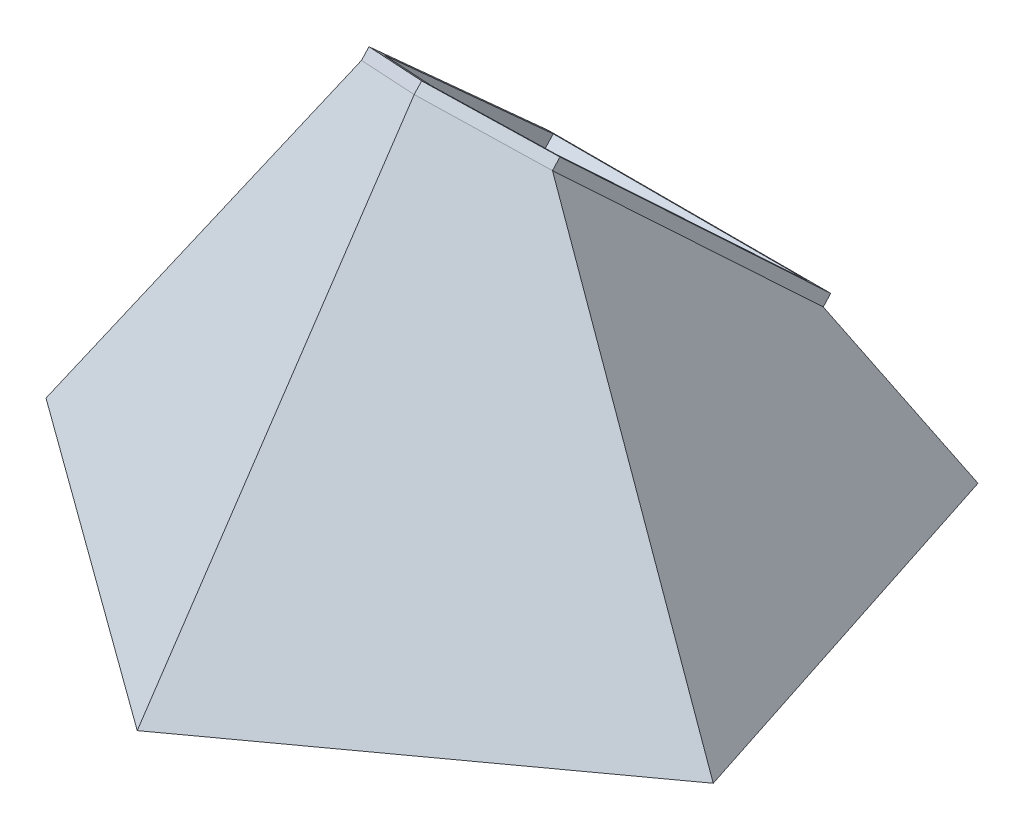
ISO-10303-21;
HEADER;
FILE_DESCRIPTION(('STEP AP214'),'2;1');
FILE_NAME('part.step','',(''),(''),'','','');
FILE_SCHEMA(('AUTOMOTIVE_DESIGN { 1 0 10303 214 1 1 1 1 }'));
ENDSEC;
DATA;
#1=APPLICATION_CONTEXT('core data for automotive mechanical design processes');
#2=APPLICATION_PROTOCOL_DEFINITION('international standard','automotive_design',2000,#1);
#3=PRODUCT_CONTEXT('',#1,'mechanical');
#4=PRODUCT('Part','Part','',(#3));
#5=PRODUCT_RELATED_PRODUCT_CATEGORY('part','',(#4));
#6=PRODUCT_DEFINITION_FORMATION('','',#4);
#7=PRODUCT_DEFINITION_CONTEXT('part definition',#1,'design');
#8=PRODUCT_DEFINITION('design','',#6,#7);
#9=PRODUCT_DEFINITION_SHAPE('','',#8);
#10=(LENGTH_UNIT() NAMED_UNIT(*) SI_UNIT(.MILLI.,.METRE.));
#11=(NAMED_UNIT(*) PLANE_ANGLE_UNIT() SI_UNIT($,.RADIAN.));
#12=(NAMED_UNIT(*) SI_UNIT($,.STERADIAN.) SOLID_ANGLE_UNIT());
#13=UNCERTAINTY_MEASURE_WITH_UNIT(LENGTH_MEASURE(1.E-05),#10,'distance_accuracy_value','');
#14=(GEOMETRIC_REPRESENTATION_CONTEXT(3) GLOBAL_UNCERTAINTY_ASSIGNED_CONTEXT((#13)) GLOBAL_UNIT_ASSIGNED_CONTEXT((#10,
#11,#12)) REPRESENTATION_CONTEXT('',''));
#15=CARTESIAN_POINT('',(0.,0.,0.));
#16=DIRECTION('',(0.,0.,1.));
#17=DIRECTION('',(1.,0.,0.));
#18=AXIS2_PLACEMENT_3D('',#15,#16,#17);
#19=CARTESIAN_POINT('',(-37.9005038770794,21.6513649291611,-12.3146202068147));
#20=DIRECTION('',(-0.835681025011948,0.477398266144197,-0.271529224794486));
#21=DIRECTION('',(-0.496034173352985,-0.868302999456999,0.));
#22=AXIS2_PLACEMENT_3D('',#19,#20,#21);
#23=PLANE('',#22);
#24=DIRECTION('',(-0.530226436000217,-0.8301681632607,0.172281012519847));
#25=VECTOR('',#24,1.);
#26=CARTESIAN_POINT('',(0.,95.,0.));
#27=LINE('',#26,#25);
#28=CARTESIAN_POINT('',(-17.3662487703551,67.8099056071806,5.64263627516887));
#29=VERTEX_POINT('',#28);
#30=CARTESIAN_POINT('',(-60.6762745781211,0.,19.7149167044675));
#31=VERTEX_POINT('',#30);
#32=EDGE_CURVE('E51',#29,#31,#27,.T.);
#33=ORIENTED_EDGE('',*,*,#32,.F.);
#34=DIRECTION('',(-0.147132683830162,-0.670925038265538,-0.726781649725226));
#35=VECTOR('',#34,1.);
#36=CARTESIAN_POINT('',(-24.287544603135,36.2487966097043,-28.5460339280515));
#37=LINE('',#36,#35);
#38=CARTESIAN_POINT('',(-25.6578947368421,30.,-35.315062433142));
#39=VERTEX_POINT('',#38);
#40=EDGE_CURVE('E297',#29,#39,#37,.T.);
#41=ORIENTED_EDGE('',*,*,#40,.T.);
#42=DIRECTION('',(-0.327697959181855,-0.8301681632607,-0.451037546393206));
#43=VECTOR('',#42,1.);
#44=CARTESIAN_POINT('',(0.,95.,0.));
#45=LINE('',#44,#43);
#46=CARTESIAN_POINT('',(-37.5,0.,-51.614322017669));
#47=VERTEX_POINT('',#46);
#48=EDGE_CURVE('E353',#39,#47,#45,.T.);
#49=ORIENTED_EDGE('',*,*,#48,.T.);
#50=DIRECTION('',(-0.309016994374947,0.,0.951056516295154));
#51=VECTOR('',#50,1.);
#52=CARTESIAN_POINT('',(-37.5,0.,-51.614322017669));
#53=LINE('',#52,#51);
#54=EDGE_CURVE('E368',#47,#31,#53,.T.);
#55=ORIENTED_EDGE('',*,*,#54,.T.);
#56=EDGE_LOOP('',(#33,#41,#49,#55));
#57=FACE_BOUND('',#56,.T.);
#58=ADVANCED_FACE('F46',(#57),#23,.T.);
#59=CARTESIAN_POINT('',(-23.4237995867822,21.6513649291611,32.2400942599872));
#60=DIRECTION('',(-0.516479277210735,0.477398266144197,0.710872739450875));
#61=DIRECTION('',(0.809016994374948,0.,0.587785252292473));
#62=AXIS2_PLACEMENT_3D('',#59,#60,#61);
#63=PLANE('',#62);
#64=DIRECTION('',(0.,-0.8301681632607,0.557513067746718));
#65=VECTOR('',#64,1.);
#66=CARTESIAN_POINT('',(0.,95.,0.));
#67=LINE('',#66,#65);
#68=CARTESIAN_POINT('',(0.,75.,13.431328552927));
#69=VERTEX_POINT('',#68);
#70=CARTESIAN_POINT('',(0.,0.,63.798810626403));
#71=VERTEX_POINT('',#70);
#72=EDGE_CURVE('E57',#69,#71,#67,.T.);
#73=ORIENTED_EDGE('',*,*,#72,.F.);
#74=DIRECTION('',(-0.853558395699013,-0.35339614881803,-0.38281748540566));
#75=VECTOR('',#74,1.);
#76=CARTESIAN_POINT('',(-27.0121004182078,63.816263412812,1.31651085594316));
#77=LINE('',#76,#75);
#78=EDGE_CURVE('E294',#69,#29,#77,.T.);
#79=ORIENTED_EDGE('',*,*,#78,.T.);
#80=ORIENTED_EDGE('',*,*,#32,.T.);
#81=DIRECTION('',(0.809016994374947,0.,0.587785252292473));
#82=VECTOR('',#81,1.);
#83=CARTESIAN_POINT('',(-60.6762745781211,0.,19.7149167044675));
#84=LINE('',#83,#82);
#85=EDGE_CURVE('E306',#31,#71,#84,.T.);
#86=ORIENTED_EDGE('',*,*,#85,.T.);
#87=EDGE_LOOP('',(#73,#79,#80,#86));
#88=FACE_BOUND('',#87,.T.);
#89=ADVANCED_FACE('F313',(#88),#63,.T.);
#90=CARTESIAN_POINT('',(37.9005038770794,21.6513649291611,-12.3146202068147));
#91=DIRECTION('',(0.835681025011948,0.477398266144197,-0.271529224794486));
#92=DIRECTION('',(-0.496034173352985,0.868302999456999,0.));
#93=AXIS2_PLACEMENT_3D('',#90,#91,#92);
#94=PLANE('',#93);
#95=DIRECTION('',(0.327697959181855,-0.8301681632607,-0.451037546393206));
#96=VECTOR('',#95,1.);
#97=CARTESIAN_POINT('',(0.,95.,0.));
#98=LINE('',#97,#96);
#99=CARTESIAN_POINT('',(25.6578947368421,30.,-35.315062433142));
#100=VERTEX_POINT('',#99);
#101=CARTESIAN_POINT('',(37.5,0.,-51.614322017669));
#102=VERTEX_POINT('',#101);
#103=EDGE_CURVE('E350',#100,#102,#98,.T.);
#104=ORIENTED_EDGE('',*,*,#103,.F.);
#105=DIRECTION('',(-0.147132683830162,0.670925038265538,0.726781649725226));
#106=VECTOR('',#105,1.);
#107=CARTESIAN_POINT('',(24.287544603135,36.2487966097043,-28.5460339280515));
#108=LINE('',#107,#106);
#109=CARTESIAN_POINT('',(17.3662487703551,67.8099056071806,5.64263627516887));
#110=VERTEX_POINT('',#109);
#111=EDGE_CURVE('E291',#100,#110,#108,.T.);
#112=ORIENTED_EDGE('',*,*,#111,.T.);
#113=DIRECTION('',(0.530226436000218,-0.8301681632607,0.172281012519847));
#114=VECTOR('',#113,1.);
#115=CARTESIAN_POINT('',(0.,95.,0.));
#116=LINE('',#115,#114);
#117=CARTESIAN_POINT('',(60.6762745781211,0.,19.7149167044675));
#118=VERTEX_POINT('',#117);
#119=EDGE_CURVE('E351',#110,#118,#116,.T.);
#120=ORIENTED_EDGE('',*,*,#119,.T.);
#121=DIRECTION('',(-0.309016994374948,0.,-0.951056516295154));
#122=VECTOR('',#121,1.);
#123=CARTESIAN_POINT('',(60.6762745781211,0.,19.7149167044675));
#124=LINE('',#123,#122);
#125=EDGE_CURVE('E438',#118,#102,#124,.T.);
#126=ORIENTED_EDGE('',*,*,#125,.T.);
#127=EDGE_LOOP('',(#104,#112,#120,#126));
#128=FACE_BOUND('',#127,.T.);
#129=ADVANCED_FACE('F323',(#128),#94,.T.);
#130=CARTESIAN_POINT('',(23.4237995867822,21.6513649291611,32.2400942599872));
#131=DIRECTION('',(0.516479277210735,0.477398266144197,0.710872739450875));
#132=DIRECTION('',(0.809016994374948,0.,-0.587785252292473));
#133=AXIS2_PLACEMENT_3D('',#130,#131,#132);
#134=PLANE('',#133);
#135=ORIENTED_EDGE('',*,*,#119,.F.);
#136=DIRECTION('',(-0.853558395699013,0.35339614881803,0.38281748540566));
#137=VECTOR('',#136,1.);
#138=CARTESIAN_POINT('',(27.0121004182078,63.816263412812,1.31651085594317));
#139=LINE('',#138,#137);
#140=EDGE_CURVE('E12',#110,#69,#139,.T.);
#141=ORIENTED_EDGE('',*,*,#140,.T.);
#142=ORIENTED_EDGE('',*,*,#72,.T.);
#143=DIRECTION('',(0.809016994374947,0.,-0.587785252292473));
#144=VECTOR('',#143,1.);
#145=CARTESIAN_POINT('',(0.,0.,63.798810626403));
#146=LINE('',#145,#144);
#147=EDGE_CURVE('E300',#71,#118,#146,.T.);
#148=ORIENTED_EDGE('',*,*,#147,.T.);
#149=EDGE_LOOP('',(#135,#141,#142,#148));
#150=FACE_BOUND('',#149,.T.);
#151=ADVANCED_FACE('F48',(#150),#134,.T.);
#152=CARTESIAN_POINT('',(0.,0.,0.));
#153=DIRECTION('',(0.,1.,0.));
#154=DIRECTION('',(0.,0.,1.));
#155=AXIS2_PLACEMENT_3D('',#152,#153,#154);
#156=PLANE('',#155);
#157=DIRECTION('',(0.809016994374948,0.,0.587785252292473));
#158=VECTOR('',#157,1.);
#159=CARTESIAN_POINT('',(-29.0002655948529,0.,39.9154412536178));
#160=LINE('',#159,#158);
#161=CARTESIAN_POINT('',(-58.0005311897058,0.,18.8455149755064));
#162=VERTEX_POINT('',#161);
#163=CARTESIAN_POINT('',(0.,0.,60.9853675317291));
#164=VERTEX_POINT('',#163);
#165=EDGE_CURVE('E216',#162,#164,#160,.T.);
#166=ORIENTED_EDGE('',*,*,#165,.T.);
#167=DIRECTION('',(0.809016994374948,0.,-0.587785252292473));
#168=VECTOR('',#167,1.);
#169=CARTESIAN_POINT('',(29.0002655948529,0.,39.9154412536178));
#170=LINE('',#169,#168);
#171=CARTESIAN_POINT('',(58.0005311897059,0.,18.8455149755064));
#172=VERTEX_POINT('',#171);
#173=EDGE_CURVE('E210',#164,#172,#170,.T.);
#174=ORIENTED_EDGE('',*,*,#173,.T.);
#175=DIRECTION('',(-0.309016994374948,0.,-0.951056516295154));
#176=VECTOR('',#175,1.);
#177=CARTESIAN_POINT('',(46.9234154152462,0.,-15.2463418829323));
#178=LINE('',#177,#176);
#179=CARTESIAN_POINT('',(35.8462996407866,0.,-49.338198741371));
#180=VERTEX_POINT('',#179);
#181=EDGE_CURVE('E227',#172,#180,#178,.T.);
#182=ORIENTED_EDGE('',*,*,#181,.T.);
#183=DIRECTION('',(-1.,0.,0.));
#184=VECTOR('',#183,1.);
#185=CARTESIAN_POINT('',(0.,0.,-49.338198741371));
#186=LINE('',#185,#184);
#187=CARTESIAN_POINT('',(-35.8462996407866,0.,-49.338198741371));
#188=VERTEX_POINT('',#187);
#189=EDGE_CURVE('E73',#180,#188,#186,.T.);
#190=ORIENTED_EDGE('',*,*,#189,.T.);
#191=DIRECTION('',(-0.309016994374947,0.,0.951056516295154));
#192=VECTOR('',#191,1.);
#193=CARTESIAN_POINT('',(-46.9234154152462,0.,-15.2463418829323));
#194=LINE('',#193,#192);
#195=EDGE_CURVE('E223',#188,#162,#194,.T.);
#196=ORIENTED_EDGE('',*,*,#195,.T.);
#197=EDGE_LOOP('',(#166,#174,#182,#190,#196));
#198=FACE_BOUND('',#197,.T.);
#199=ORIENTED_EDGE('',*,*,#147,.F.);
#200=ORIENTED_EDGE('',*,*,#85,.F.);
#201=ORIENTED_EDGE('',*,*,#54,.F.);
#202=DIRECTION('',(-1.,0.,0.));
#203=VECTOR('',#202,1.);
#204=CARTESIAN_POINT('',(37.5,0.,-51.614322017669));
#205=LINE('',#204,#203);
#206=EDGE_CURVE('E444',#102,#47,#205,.T.);
#207=ORIENTED_EDGE('',*,*,#206,.F.);
#208=ORIENTED_EDGE('',*,*,#125,.F.);
#209=EDGE_LOOP('',(#199,#200,#201,#207,#208));
#210=FACE_BOUND('',#209,.T.);
#211=ADVANCED_FACE('F330',(#198,#210),#156,.F.);
#212=CARTESIAN_POINT('',(0.,21.6513649291611,-39.850948106345));
#213=DIRECTION('',(0.,0.477398266144197,-0.878687029312778));
#214=DIRECTION('',(0.,0.878687029312778,0.477398266144197));
#215=AXIS2_PLACEMENT_3D('',#212,#213,#214);
#216=PLANE('',#215);
#217=DIRECTION('',(-1.,0.,0.));
#218=VECTOR('',#217,1.);
#219=CARTESIAN_POINT('',(247.070387531937,30.,-35.315062433142));
#220=LINE('',#219,#218);
#221=EDGE_CURVE('E288',#100,#39,#220,.T.);
#222=ORIENTED_EDGE('',*,*,#221,.F.);
#223=ORIENTED_EDGE('',*,*,#103,.T.);
#224=ORIENTED_EDGE('',*,*,#206,.T.);
#225=ORIENTED_EDGE('',*,*,#48,.F.);
#226=EDGE_LOOP('',(#222,#223,#224,#225));
#227=FACE_BOUND('',#226,.T.);
#228=ADVANCED_FACE('F326',(#227),#216,.T.);
#229=CARTESIAN_POINT('',(0.,35.2677578819555,-32.5572636780752));
#230=DIRECTION('',(0.,0.734778416444804,-0.678307215593986));
#231=DIRECTION('',(0.,0.678307215593986,0.734778416444804));
#232=AXIS2_PLACEMENT_3D('',#229,#230,#231);
#233=PLANE('',#232);
#234=DIRECTION('',(-1.,0.,0.));
#235=VECTOR('',#234,1.);
#236=CARTESIAN_POINT('',(25.6578947368421,31.4695568328896,-36.6716768643299));
#237=LINE('',#236,#235);
#238=CARTESIAN_POINT('',(25.6578947368421,31.4695568328896,-36.6716768643299));
#239=VERTEX_POINT('',#238);
#240=CARTESIAN_POINT('',(-25.6578947368421,31.4695568328896,-36.6716768643299));
#241=VERTEX_POINT('',#240);
#242=EDGE_CURVE('E264',#239,#241,#237,.T.);
#243=ORIENTED_EDGE('',*,*,#242,.T.);
#244=DIRECTION('',(0.147132683830162,0.670925038265538,0.726781649725226));
#245=VECTOR('',#244,1.);
#246=CARTESIAN_POINT('',(-25.6578947368421,31.4695568328896,-36.6716768643299));
#247=LINE('',#246,#245);
#248=CARTESIAN_POINT('',(-17.3662487703551,69.2794624400702,4.2860218439809));
#249=VERTEX_POINT('',#248);
#250=EDGE_CURVE('E267',#241,#249,#247,.T.);
#251=ORIENTED_EDGE('',*,*,#250,.T.);
#252=DIRECTION('',(0.853558395699012,0.353396148818031,0.38281748540566));
#253=VECTOR('',#252,1.);
#254=CARTESIAN_POINT('',(-17.3662487703551,69.2794624400702,4.2860218439809));
#255=LINE('',#254,#253);
#256=CARTESIAN_POINT('',(0.,76.4695568328896,12.074714121739));
#257=VERTEX_POINT('',#256);
#258=EDGE_CURVE('E269',#249,#257,#255,.T.);
#259=ORIENTED_EDGE('',*,*,#258,.T.);
#260=DIRECTION('',(0.853558395699012,-0.35339614881803,-0.38281748540566));
#261=VECTOR('',#260,1.);
#262=CARTESIAN_POINT('',(0.,76.4695568328896,12.074714121739));
#263=LINE('',#262,#261);
#264=CARTESIAN_POINT('',(17.3662487703551,69.2794624400702,4.2860218439809));
#265=VERTEX_POINT('',#264);
#266=EDGE_CURVE('E271',#257,#265,#263,.T.);
#267=ORIENTED_EDGE('',*,*,#266,.T.);
#268=DIRECTION('',(0.147132683830162,-0.670925038265538,-0.726781649725226));
#269=VECTOR('',#268,1.);
#270=CARTESIAN_POINT('',(17.3662487703551,69.2794624400702,4.2860218439809));
#271=LINE('',#270,#269);
#272=EDGE_CURVE('E273',#265,#239,#271,.T.);
#273=ORIENTED_EDGE('',*,*,#272,.T.);
#274=EDGE_LOOP('',(#243,#251,#259,#267,#273));
#275=FACE_BOUND('',#274,.T.);
#276=DIRECTION('',(0.147132683830161,-0.670925038265538,-0.726781649725226));
#277=VECTOR('',#276,1.);
#278=CARTESIAN_POINT('',(15.5256714909766,68.4521476217615,3.38983047505099));
#279=LINE('',#278,#277);
#280=CARTESIAN_POINT('',(15.5256714909766,68.4521476217615,3.38983047505099));
#281=VERTEX_POINT('',#280);
#282=CARTESIAN_POINT('',(23.3383856045037,32.8261712640776,-35.2021200314403));
#283=VERTEX_POINT('',#282);
#284=EDGE_CURVE('E250',#281,#283,#279,.T.);
#285=ORIENTED_EDGE('',*,*,#284,.F.);
#286=DIRECTION('',(0.853558395699012,-0.35339614881803,-0.38281748540566));
#287=VECTOR('',#286,1.);
#288=CARTESIAN_POINT('',(0.,74.880193482914,10.3530312933648));
#289=LINE('',#288,#287);
#290=CARTESIAN_POINT('',(0.,74.880193482914,10.3530312933648));
#291=VERTEX_POINT('',#290);
#292=EDGE_CURVE('E248',#291,#281,#289,.T.);
#293=ORIENTED_EDGE('',*,*,#292,.F.);
#294=DIRECTION('',(0.853558395699012,0.35339614881803,0.38281748540566));
#295=VECTOR('',#294,1.);
#296=CARTESIAN_POINT('',(-15.5256714909766,68.4521476217615,3.38983047505099));
#297=LINE('',#296,#295);
#298=CARTESIAN_POINT('',(-15.5256714909766,68.4521476217615,3.38983047505098));
#299=VERTEX_POINT('',#298);
#300=EDGE_CURVE('E186',#299,#291,#297,.T.);
#301=ORIENTED_EDGE('',*,*,#300,.F.);
#302=DIRECTION('',(0.147132683830162,0.670925038265538,0.726781649725226));
#303=VECTOR('',#302,1.);
#304=CARTESIAN_POINT('',(-23.3383856045038,32.8261712640776,-35.2021200314403));
#305=LINE('',#304,#303);
#306=CARTESIAN_POINT('',(-23.3383856045038,32.8261712640776,-35.2021200314403));
#307=VERTEX_POINT('',#306);
#308=EDGE_CURVE('E254',#307,#299,#305,.T.);
#309=ORIENTED_EDGE('',*,*,#308,.F.);
#310=DIRECTION('',(-1.,0.,0.));
#311=VECTOR('',#310,1.);
#312=CARTESIAN_POINT('',(23.3383856045037,32.8261712640776,-35.2021200314403));
#313=LINE('',#312,#311);
#314=EDGE_CURVE('E252',#283,#307,#313,.T.);
#315=ORIENTED_EDGE('',*,*,#314,.F.);
#316=EDGE_LOOP('',(#285,#293,#301,#309,#315));
#317=FACE_BOUND('',#316,.T.);
#318=ADVANCED_FACE('F329',(#275,#317),#233,.T.);
#319=CARTESIAN_POINT('',(25.6578947368421,31.4695568328896,-36.6716768643299));
#320=DIRECTION('',(0.,0.678307215593986,0.734778416444804));
#321=DIRECTION('',(0.,-0.734778416444804,0.678307215593986));
#322=AXIS2_PLACEMENT_3D('',#319,#320,#321);
#323=PLANE('',#322);
#324=ORIENTED_EDGE('',*,*,#221,.T.);
#325=DIRECTION('',(0.,-0.734778416444804,0.678307215593986));
#326=VECTOR('',#325,1.);
#327=CARTESIAN_POINT('',(-25.6578947368421,31.4695568328896,-36.6716768643299));
#328=LINE('',#327,#326);
#329=EDGE_CURVE('E286',#241,#39,#328,.T.);
#330=ORIENTED_EDGE('',*,*,#329,.F.);
#331=ORIENTED_EDGE('',*,*,#242,.F.);
#332=DIRECTION('',(0.,-0.734778416444804,0.678307215593986));
#333=VECTOR('',#332,1.);
#334=CARTESIAN_POINT('',(25.6578947368421,31.4695568328896,-36.6716768643299));
#335=LINE('',#334,#333);
#336=EDGE_CURVE('E275',#239,#100,#335,.T.);
#337=ORIENTED_EDGE('',*,*,#336,.T.);
#338=EDGE_LOOP('',(#324,#330,#331,#337));
#339=FACE_BOUND('',#338,.T.);
#340=ADVANCED_FACE('F417',(#339),#323,.F.);
#341=CARTESIAN_POINT('',(-25.6578947368421,31.4695568328896,-36.6716768643299));
#342=DIRECTION('',(0.989116764264429,-0.0998011610917075,-0.108109920432001));
#343=DIRECTION('',(-0.10865237817571,0.,-0.994079806009941));
#344=AXIS2_PLACEMENT_3D('',#341,#342,#343);
#345=PLANE('',#344);
#346=ORIENTED_EDGE('',*,*,#40,.F.);
#347=DIRECTION('',(0.,-0.734778416444804,0.678307215593986));
#348=VECTOR('',#347,1.);
#349=CARTESIAN_POINT('',(-17.3662487703551,69.2794624400702,4.2860218439809));
#350=LINE('',#349,#348);
#351=EDGE_CURVE('E283',#249,#29,#350,.T.);
#352=ORIENTED_EDGE('',*,*,#351,.F.);
#353=ORIENTED_EDGE('',*,*,#250,.F.);
#354=ORIENTED_EDGE('',*,*,#329,.T.);
#355=EDGE_LOOP('',(#346,#352,#353,#354));
#356=FACE_BOUND('',#355,.T.);
#357=ADVANCED_FACE('F471',(#356),#345,.F.);
#358=CARTESIAN_POINT('',(-17.3662487703551,69.2794624400702,4.2860218439809));
#359=DIRECTION('',(0.520997183420149,-0.578974818733467,-0.627176286334888));
#360=DIRECTION('',(0.,0.734778416444804,-0.678307215593986));
#361=AXIS2_PLACEMENT_3D('',#358,#359,#360);
#362=PLANE('',#361);
#363=ORIENTED_EDGE('',*,*,#78,.F.);
#364=DIRECTION('',(0.,-0.734778416444804,0.678307215593986));
#365=VECTOR('',#364,1.);
#366=CARTESIAN_POINT('',(0.,76.4695568328896,12.074714121739));
#367=LINE('',#366,#365);
#368=EDGE_CURVE('E280',#257,#69,#367,.T.);
#369=ORIENTED_EDGE('',*,*,#368,.F.);
#370=ORIENTED_EDGE('',*,*,#258,.F.);
#371=ORIENTED_EDGE('',*,*,#351,.T.);
#372=EDGE_LOOP('',(#363,#369,#370,#371));
#373=FACE_BOUND('',#372,.T.);
#374=ADVANCED_FACE('F469',(#373),#362,.F.);
#375=CARTESIAN_POINT('',(0.,76.4695568328896,12.074714121739));
#376=DIRECTION('',(-0.520997183420149,-0.578974818733467,-0.627176286334888));
#377=DIRECTION('',(0.,0.734778416444804,-0.678307215593986));
#378=AXIS2_PLACEMENT_3D('',#375,#376,#377);
#379=PLANE('',#378);
#380=ORIENTED_EDGE('',*,*,#140,.F.);
#381=DIRECTION('',(0.,-0.734778416444804,0.678307215593986));
#382=VECTOR('',#381,1.);
#383=CARTESIAN_POINT('',(17.3662487703551,69.2794624400702,4.2860218439809));
#384=LINE('',#383,#382);
#385=EDGE_CURVE('E278',#265,#110,#384,.T.);
#386=ORIENTED_EDGE('',*,*,#385,.F.);
#387=ORIENTED_EDGE('',*,*,#266,.F.);
#388=ORIENTED_EDGE('',*,*,#368,.T.);
#389=EDGE_LOOP('',(#380,#386,#387,#388));
#390=FACE_BOUND('',#389,.T.);
#391=ADVANCED_FACE('F465',(#390),#379,.F.);
#392=CARTESIAN_POINT('',(17.3662487703551,69.2794624400702,4.2860218439809));
#393=DIRECTION('',(-0.989116764264429,-0.0998011610917071,-0.108109920432));
#394=DIRECTION('',(-0.108652378175709,0.,0.994079806009941));
#395=AXIS2_PLACEMENT_3D('',#392,#393,#394);
#396=PLANE('',#395);
#397=ORIENTED_EDGE('',*,*,#111,.F.);
#398=ORIENTED_EDGE('',*,*,#336,.F.);
#399=ORIENTED_EDGE('',*,*,#272,.F.);
#400=ORIENTED_EDGE('',*,*,#385,.T.);
#401=EDGE_LOOP('',(#397,#398,#399,#400));
#402=FACE_BOUND('',#401,.T.);
#403=ADVANCED_FACE('F463',(#402),#396,.F.);
#404=CARTESIAN_POINT('',(0.,74.880193482914,10.3530312933648));
#405=DIRECTION('',(-0.520997183420149,-0.578974818733467,-0.627176286334888));
#406=DIRECTION('',(0.,0.734778416444804,-0.678307215593986));
#407=AXIS2_PLACEMENT_3D('',#404,#405,#406);
#408=PLANE('',#407);
#409=DIRECTION('',(0.,-0.734778416444804,0.678307215593986));
#410=VECTOR('',#409,1.);
#411=CARTESIAN_POINT('',(15.5256714909766,68.4521476217615,3.38983047505099));
#412=LINE('',#411,#410);
#413=CARTESIAN_POINT('',(15.5256714909766,65.5130339559823,6.10305933742693));
#414=VERTEX_POINT('',#413);
#415=EDGE_CURVE('E194',#281,#414,#412,.T.);
#416=ORIENTED_EDGE('',*,*,#415,.T.);
#417=DIRECTION('',(0.853558395699013,-0.35339614881803,-0.382817485405659));
#418=VECTOR('',#417,1.);
#419=CARTESIAN_POINT('',(0.,71.9410798171348,13.0662601557407));
#420=LINE('',#419,#418);
#421=CARTESIAN_POINT('',(0.,71.9410798171348,13.0662601557407));
#422=VERTEX_POINT('',#421);
#423=EDGE_CURVE('E191',#422,#414,#420,.T.);
#424=ORIENTED_EDGE('',*,*,#423,.F.);
#425=DIRECTION('',(0.,-0.734778416444804,0.678307215593986));
#426=VECTOR('',#425,1.);
#427=CARTESIAN_POINT('',(0.,74.880193482914,10.3530312933648));
#428=LINE('',#427,#426);
#429=EDGE_CURVE('E180',#291,#422,#428,.T.);
#430=ORIENTED_EDGE('',*,*,#429,.F.);
#431=ORIENTED_EDGE('',*,*,#292,.T.);
#432=EDGE_LOOP('',(#416,#424,#430,#431));
#433=FACE_BOUND('',#432,.T.);
#434=ADVANCED_FACE('F192',(#433),#408,.T.);
#435=CARTESIAN_POINT('',(15.5256714909766,68.4521476217615,3.38983047505099));
#436=DIRECTION('',(-0.989116764264429,-0.0998011610917071,-0.108109920432));
#437=DIRECTION('',(-0.108652378175709,0.,0.994079806009941));
#438=AXIS2_PLACEMENT_3D('',#435,#436,#437);
#439=PLANE('',#438);
#440=DIRECTION('',(0.,-0.734778416444804,0.678307215593986));
#441=VECTOR('',#440,1.);
#442=CARTESIAN_POINT('',(23.3383856045037,32.8261712640776,-35.2021200314403));
#443=LINE('',#442,#441);
#444=CARTESIAN_POINT('',(23.3383856045037,29.8870575982984,-32.4888911690644));
#445=VERTEX_POINT('',#444);
#446=EDGE_CURVE('E261',#283,#445,#443,.T.);
#447=ORIENTED_EDGE('',*,*,#446,.T.);
#448=DIRECTION('',(0.147132683830161,-0.670925038265538,-0.726781649725226));
#449=VECTOR('',#448,1.);
#450=CARTESIAN_POINT('',(15.5256714909766,65.5130339559823,6.10305933742693));
#451=LINE('',#450,#449);
#452=CARTESIAN_POINT('',(15.5798409826667,65.2660210738753,5.83548185898725));
#453=VERTEX_POINT('',#452);
#454=EDGE_CURVE('E195',#453,#445,#451,.T.);
#455=ORIENTED_EDGE('',*,*,#454,.F.);
#456=EDGE_CURVE('E65',#414,#453,#451,.T.);
#457=ORIENTED_EDGE('',*,*,#456,.F.);
#458=ORIENTED_EDGE('',*,*,#415,.F.);
#459=ORIENTED_EDGE('',*,*,#284,.T.);
#460=EDGE_LOOP('',(#447,#455,#457,#458,#459));
#461=FACE_BOUND('',#460,.T.);
#462=ADVANCED_FACE('F550',(#461),#439,.T.);
#463=CARTESIAN_POINT('',(23.3383856045037,32.8261712640776,-35.2021200314403));
#464=DIRECTION('',(0.,0.678307215593986,0.734778416444804));
#465=DIRECTION('',(0.,-0.734778416444804,0.678307215593986));
#466=AXIS2_PLACEMENT_3D('',#463,#464,#465);
#467=PLANE('',#466);
#468=DIRECTION('',(0.,-0.734778416444804,0.678307215593986));
#469=VECTOR('',#468,1.);
#470=CARTESIAN_POINT('',(-23.3383856045038,32.8261712640776,-35.2021200314403));
#471=LINE('',#470,#469);
#472=CARTESIAN_POINT('',(-23.3383856045038,29.8870575982984,-32.4888911690644));
#473=VERTEX_POINT('',#472);
#474=EDGE_CURVE('E259',#307,#473,#471,.T.);
#475=ORIENTED_EDGE('',*,*,#474,.T.);
#476=DIRECTION('',(-1.,0.,0.));
#477=VECTOR('',#476,1.);
#478=CARTESIAN_POINT('',(23.3383856045037,29.8870575982984,-32.4888911690644));
#479=LINE('',#478,#477);
#480=EDGE_CURVE('E204',#445,#473,#479,.T.);
#481=ORIENTED_EDGE('',*,*,#480,.F.);
#482=ORIENTED_EDGE('',*,*,#446,.F.);
#483=ORIENTED_EDGE('',*,*,#314,.T.);
#484=EDGE_LOOP('',(#475,#481,#482,#483));
#485=FACE_BOUND('',#484,.T.);
#486=ADVANCED_FACE('F558',(#485),#467,.T.);
#487=CARTESIAN_POINT('',(-23.3383856045038,32.8261712640776,-35.2021200314403));
#488=DIRECTION('',(0.989116764264429,-0.0998011610917075,-0.108109920432001));
#489=DIRECTION('',(-0.10865237817571,0.,-0.994079806009941));
#490=AXIS2_PLACEMENT_3D('',#487,#488,#489);
#491=PLANE('',#490);
#492=DIRECTION('',(0.,-0.734778416444804,0.678307215593986));
#493=VECTOR('',#492,1.);
#494=CARTESIAN_POINT('',(-15.5256714909766,68.4521476217615,3.38983047505099));
#495=LINE('',#494,#493);
#496=CARTESIAN_POINT('',(-15.5256714909766,65.5130339559823,6.10305933742693));
#497=VERTEX_POINT('',#496);
#498=EDGE_CURVE('E189',#299,#497,#495,.T.);
#499=ORIENTED_EDGE('',*,*,#498,.T.);
#500=DIRECTION('',(0.147132683830162,0.670925038265538,0.726781649725226));
#501=VECTOR('',#500,1.);
#502=CARTESIAN_POINT('',(-23.3383856045038,29.8870575982984,-32.4888911690644));
#503=LINE('',#502,#501);
#504=CARTESIAN_POINT('',(-15.5798409826667,65.2660210738753,5.83548185898724));
#505=VERTEX_POINT('',#504);
#506=EDGE_CURVE('E200',#505,#497,#503,.T.);
#507=ORIENTED_EDGE('',*,*,#506,.F.);
#508=EDGE_CURVE('E207',#473,#505,#503,.T.);
#509=ORIENTED_EDGE('',*,*,#508,.F.);
#510=ORIENTED_EDGE('',*,*,#474,.F.);
#511=ORIENTED_EDGE('',*,*,#308,.T.);
#512=EDGE_LOOP('',(#499,#507,#509,#510,#511));
#513=FACE_BOUND('',#512,.T.);
#514=ADVANCED_FACE('F566',(#513),#491,.T.);
#515=CARTESIAN_POINT('',(-15.5256714909766,68.4521476217615,3.38983047505099));
#516=DIRECTION('',(0.520997183420149,-0.578974818733467,-0.627176286334888));
#517=DIRECTION('',(0.,0.734778416444804,-0.678307215593986));
#518=AXIS2_PLACEMENT_3D('',#515,#516,#517);
#519=PLANE('',#518);
#520=ORIENTED_EDGE('',*,*,#429,.T.);
#521=DIRECTION('',(0.853558395699013,0.35339614881803,0.38281748540566));
#522=VECTOR('',#521,1.);
#523=CARTESIAN_POINT('',(-15.5256714909766,65.5130339559823,6.10305933742693));
#524=LINE('',#523,#522);
#525=EDGE_CURVE('E184',#497,#422,#524,.T.);
#526=ORIENTED_EDGE('',*,*,#525,.F.);
#527=ORIENTED_EDGE('',*,*,#498,.F.);
#528=ORIENTED_EDGE('',*,*,#300,.T.);
#529=EDGE_LOOP('',(#520,#526,#527,#528));
#530=FACE_BOUND('',#529,.T.);
#531=ADVANCED_FACE('F182',(#530),#519,.T.);
#532=CARTESIAN_POINT('',(247.070387531937,73.5304431671104,14.7879429841149));
#533=DIRECTION('',(0.,0.734778416444804,-0.678307215593986));
#534=DIRECTION('',(0.,0.678307215593986,0.734778416444804));
#535=AXIS2_PLACEMENT_3D('',#532,#533,#534);
#536=PLANE('',#535);
#537=ORIENTED_EDGE('',*,*,#480,.T.);
#538=ORIENTED_EDGE('',*,*,#508,.T.);
#539=DIRECTION('',(-0.853558395699013,-0.35339614881803,-0.38281748540566));
#540=VECTOR('',#539,1.);
#541=CARTESIAN_POINT('',(-25.8228668626815,61.0251326748148,1.24152621390087));
#542=LINE('',#541,#540);
#543=CARTESIAN_POINT('',(-16.5796716185558,64.8520642807912,5.38706186594251));
#544=VERTEX_POINT('',#543);
#545=EDGE_CURVE('E219',#505,#544,#542,.T.);
#546=ORIENTED_EDGE('',*,*,#545,.T.);
#547=DIRECTION('',(0.147132683830162,0.670925038265538,0.726781649725226));
#548=VECTOR('',#547,1.);
#549=CARTESIAN_POINT('',(-9.01021435955898,99.3687893818169,42.7774124733482));
#550=LINE('',#549,#548);
#551=CARTESIAN_POINT('',(-24.4957604135263,28.7546993757259,-33.7155217613712));
#552=VERTEX_POINT('',#551);
#553=EDGE_CURVE('E240',#552,#544,#550,.T.);
#554=ORIENTED_EDGE('',*,*,#553,.F.);
#555=DIRECTION('',(-1.,0.,0.));
#556=VECTOR('',#555,1.);
#557=CARTESIAN_POINT('',(247.070387531937,28.7546993757259,-33.7155217613712));
#558=LINE('',#557,#556);
#559=CARTESIAN_POINT('',(24.4957604135264,28.7546993757259,-33.7155217613711));
#560=VERTEX_POINT('',#559);
#561=EDGE_CURVE('E245',#560,#552,#558,.T.);
#562=ORIENTED_EDGE('',*,*,#561,.F.);
#563=DIRECTION('',(0.147132683830162,-0.670925038265538,-0.726781649725226));
#564=VECTOR('',#563,1.);
#565=CARTESIAN_POINT('',(19.7073870275204,50.5896820159133,-10.062708406869));
#566=LINE('',#565,#564);
#567=CARTESIAN_POINT('',(16.5796716185559,64.8520642807912,5.38706186594252));
#568=VERTEX_POINT('',#567);
#569=EDGE_CURVE('E243',#568,#560,#566,.T.);
#570=ORIENTED_EDGE('',*,*,#569,.F.);
#571=DIRECTION('',(-0.853558395699013,0.35339614881803,0.38281748540566));
#572=VECTOR('',#571,1.);
#573=CARTESIAN_POINT('',(25.8228668626815,61.0251326748148,1.24152621390089));
#574=LINE('',#573,#572);
#575=EDGE_CURVE('E237',#568,#453,#574,.T.);
#576=ORIENTED_EDGE('',*,*,#575,.T.);
#577=ORIENTED_EDGE('',*,*,#454,.T.);
#578=EDGE_LOOP('',(#537,#538,#546,#554,#562,#570,#576,#577));
#579=FACE_BOUND('',#578,.T.);
#580=ADVANCED_FACE('F581',(#579),#536,.F.);
#581=CARTESIAN_POINT('',(-36.2291418270555,20.6965683968727,-11.7715617572257));
#582=DIRECTION('',(-0.835681025011948,0.477398266144197,-0.271529224794486));
#583=DIRECTION('',(-0.496034173352985,-0.868302999456999,0.));
#584=AXIS2_PLACEMENT_3D('',#581,#582,#583);
#585=PLANE('',#584);
#586=ORIENTED_EDGE('',*,*,#553,.T.);
#587=DIRECTION('',(-0.530226436000217,-0.8301681632607,0.172281012519847));
#588=VECTOR('',#587,1.);
#589=CARTESIAN_POINT('',(-39.9727584838008,28.2258332267242,12.9879365441479));
#590=LINE('',#589,#588);
#591=EDGE_CURVE('E211',#544,#162,#590,.T.);
#592=ORIENTED_EDGE('',*,*,#591,.T.);
#593=ORIENTED_EDGE('',*,*,#195,.F.);
#594=DIRECTION('',(-0.327697959181855,-0.8301681632607,-0.451037546393206));
#595=VECTOR('',#594,1.);
#596=CARTESIAN_POINT('',(-24.7045233670796,28.2258332267243,-34.0028593163061));
#597=LINE('',#596,#595);
#598=EDGE_CURVE('E214',#552,#188,#597,.T.);
#599=ORIENTED_EDGE('',*,*,#598,.F.);
#600=EDGE_LOOP('',(#586,#592,#593,#599));
#601=FACE_BOUND('',#600,.T.);
#602=ADVANCED_FACE('F588',(#601),#585,.F.);
#603=CARTESIAN_POINT('',(-22.3908410323607,20.6965683968727,30.8183487810854));
#604=DIRECTION('',(-0.516479277210735,0.477398266144197,0.710872739450875));
#605=DIRECTION('',(0.809016994374948,0.,0.587785252292473));
#606=AXIS2_PLACEMENT_3D('',#603,#604,#605);
#607=PLANE('',#606);
#608=DIRECTION('',(0.,-0.8301681632607,0.557513067746718));
#609=VECTOR('',#608,1.);
#610=CARTESIAN_POINT('',(0.,28.2258332267242,42.0298455443163));
#611=LINE('',#610,#609);
#612=CARTESIAN_POINT('',(0.,71.716494562526,12.8229774750548));
#613=VERTEX_POINT('',#612);
#614=EDGE_CURVE('E217',#613,#164,#611,.T.);
#615=ORIENTED_EDGE('',*,*,#614,.T.);
#616=ORIENTED_EDGE('',*,*,#165,.F.);
#617=ORIENTED_EDGE('',*,*,#591,.F.);
#618=ORIENTED_EDGE('',*,*,#545,.F.);
#619=EDGE_CURVE('E234',#613,#505,#542,.T.);
#620=ORIENTED_EDGE('',*,*,#619,.F.);
#621=EDGE_LOOP('',(#615,#616,#617,#618,#620));
#622=FACE_BOUND('',#621,.T.);
#623=ADVANCED_FACE('F596',(#622),#607,.F.);
#624=CARTESIAN_POINT('',(36.2291418270555,20.6965683968727,-11.7715617572258));
#625=DIRECTION('',(0.835681025011948,0.477398266144197,-0.271529224794486));
#626=DIRECTION('',(-0.496034173352985,0.868302999456999,0.));
#627=AXIS2_PLACEMENT_3D('',#624,#625,#626);
#628=PLANE('',#627);
#629=ORIENTED_EDGE('',*,*,#569,.T.);
#630=DIRECTION('',(0.327697959181855,-0.8301681632607,-0.451037546393206));
#631=VECTOR('',#630,1.);
#632=CARTESIAN_POINT('',(24.7045233670796,28.2258332267243,-34.0028593163061));
#633=LINE('',#632,#631);
#634=EDGE_CURVE('E213',#560,#180,#633,.T.);
#635=ORIENTED_EDGE('',*,*,#634,.T.);
#636=ORIENTED_EDGE('',*,*,#181,.F.);
#637=DIRECTION('',(0.530226436000218,-0.8301681632607,0.172281012519847));
#638=VECTOR('',#637,1.);
#639=CARTESIAN_POINT('',(39.9727584838009,28.2258332267243,12.9879365441479));
#640=LINE('',#639,#638);
#641=EDGE_CURVE('E220',#568,#172,#640,.T.);
#642=ORIENTED_EDGE('',*,*,#641,.F.);
#643=EDGE_LOOP('',(#629,#635,#636,#642));
#644=FACE_BOUND('',#643,.T.);
#645=ADVANCED_FACE('F604',(#644),#628,.F.);
#646=CARTESIAN_POINT('',(22.3908410323607,20.6965683968727,30.8183487810855));
#647=DIRECTION('',(0.516479277210735,0.477398266144197,0.710872739450875));
#648=DIRECTION('',(0.809016994374948,0.,-0.587785252292473));
#649=AXIS2_PLACEMENT_3D('',#646,#647,#648);
#650=PLANE('',#649);
#651=ORIENTED_EDGE('',*,*,#641,.T.);
#652=ORIENTED_EDGE('',*,*,#173,.F.);
#653=ORIENTED_EDGE('',*,*,#614,.F.);
#654=EDGE_CURVE('E236',#453,#613,#574,.T.);
#655=ORIENTED_EDGE('',*,*,#654,.F.);
#656=ORIENTED_EDGE('',*,*,#575,.F.);
#657=EDGE_LOOP('',(#651,#652,#653,#655,#656));
#658=FACE_BOUND('',#657,.T.);
#659=ADVANCED_FACE('F612',(#658),#650,.F.);
#660=CARTESIAN_POINT('',(0.,20.6965683968727,-38.0935740477194));
#661=DIRECTION('',(0.,0.477398266144197,-0.878687029312778));
#662=DIRECTION('',(0.,0.878687029312778,0.477398266144197));
#663=AXIS2_PLACEMENT_3D('',#660,#661,#662);
#664=PLANE('',#663);
#665=ORIENTED_EDGE('',*,*,#561,.T.);
#666=ORIENTED_EDGE('',*,*,#598,.T.);
#667=ORIENTED_EDGE('',*,*,#189,.F.);
#668=ORIENTED_EDGE('',*,*,#634,.F.);
#669=EDGE_LOOP('',(#665,#666,#667,#668));
#670=FACE_BOUND('',#669,.T.);
#671=ADVANCED_FACE('F619',(#670),#664,.F.);
#672=CARTESIAN_POINT('',(0.,32.3286442161762,-29.8440348156993));
#673=DIRECTION('',(0.,0.734778416444804,-0.678307215593986));
#674=DIRECTION('',(0.,0.678307215593986,0.734778416444804));
#675=AXIS2_PLACEMENT_3D('',#672,#673,#674);
#676=PLANE('',#675);
#677=ORIENTED_EDGE('',*,*,#619,.T.);
#678=ORIENTED_EDGE('',*,*,#506,.T.);
#679=ORIENTED_EDGE('',*,*,#525,.T.);
#680=ORIENTED_EDGE('',*,*,#423,.T.);
#681=ORIENTED_EDGE('',*,*,#456,.T.);
#682=ORIENTED_EDGE('',*,*,#654,.T.);
#683=EDGE_LOOP('',(#677,#678,#679,#680,#681,#682));
#684=FACE_BOUND('',#683,.T.);
#685=ADVANCED_FACE('F198',(#684),#676,.T.);
#686=CLOSED_SHELL('',(#58,#89,#129,#151,#211,#228,#318,#340,#357,#374,#391,#403,#434,#462,#486,
#514,#531,#580,#602,#623,#645,#659,#671,#685));
#687=MANIFOLD_SOLID_BREP('B2',#686);
#688=ADVANCED_BREP_SHAPE_REPRESENTATION('',(#18,#687),#14);
#689=SHAPE_DEFINITION_REPRESENTATION(#9,#688);
ENDSEC;
END-ISO-10303-21;
